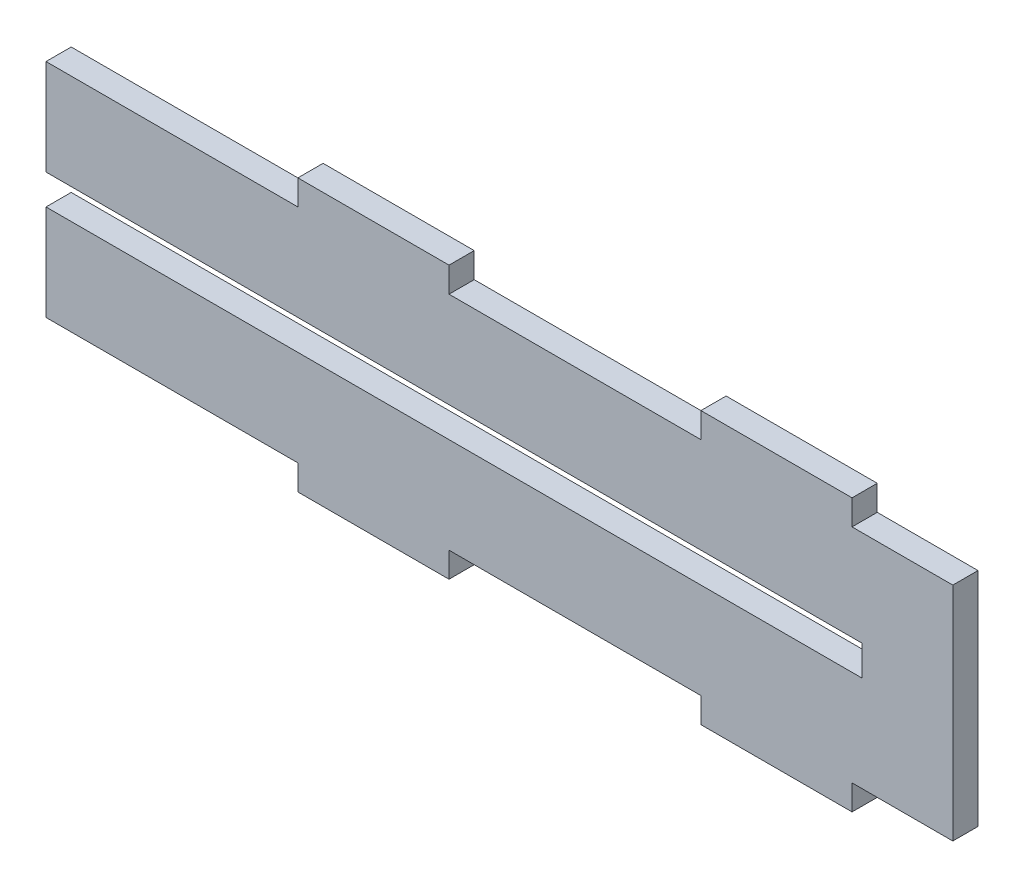
ISO-10303-21;
HEADER;
FILE_DESCRIPTION(('STEP AP214'),'2;1');
FILE_NAME('part.step','',(''),(''),'','','');
FILE_SCHEMA(('AUTOMOTIVE_DESIGN { 1 0 10303 214 1 1 1 1 }'));
ENDSEC;
DATA;
#1=APPLICATION_CONTEXT('core data for automotive mechanical design processes');
#2=APPLICATION_PROTOCOL_DEFINITION('international standard','automotive_design',2000,#1);
#3=PRODUCT_CONTEXT('',#1,'mechanical');
#4=PRODUCT('Part','Part','',(#3));
#5=PRODUCT_RELATED_PRODUCT_CATEGORY('part','',(#4));
#6=PRODUCT_DEFINITION_FORMATION('','',#4);
#7=PRODUCT_DEFINITION_CONTEXT('part definition',#1,'design');
#8=PRODUCT_DEFINITION('design','',#6,#7);
#9=PRODUCT_DEFINITION_SHAPE('','',#8);
#10=(LENGTH_UNIT() NAMED_UNIT(*) SI_UNIT(.MILLI.,.METRE.));
#11=(NAMED_UNIT(*) PLANE_ANGLE_UNIT() SI_UNIT($,.RADIAN.));
#12=(NAMED_UNIT(*) SI_UNIT($,.STERADIAN.) SOLID_ANGLE_UNIT());
#13=UNCERTAINTY_MEASURE_WITH_UNIT(LENGTH_MEASURE(1.E-05),#10,'distance_accuracy_value','');
#14=(GEOMETRIC_REPRESENTATION_CONTEXT(3) GLOBAL_UNCERTAINTY_ASSIGNED_CONTEXT((#13)) GLOBAL_UNIT_ASSIGNED_CONTEXT((#10,
#11,#12)) REPRESENTATION_CONTEXT('',''));
#15=CARTESIAN_POINT('',(0.,0.,0.));
#16=DIRECTION('',(0.,0.,1.));
#17=DIRECTION('',(1.,0.,0.));
#18=AXIS2_PLACEMENT_3D('',#15,#16,#17);
#19=CARTESIAN_POINT('',(180.,0.,5.));
#20=DIRECTION('',(1.,0.,0.));
#21=DIRECTION('',(0.,0.,-1.));
#22=AXIS2_PLACEMENT_3D('',#19,#20,#21);
#23=PLANE('',#22);
#24=DIRECTION('',(0.,-1.,0.));
#25=VECTOR('',#24,1.);
#26=CARTESIAN_POINT('',(180.,0.,0.));
#27=LINE('',#26,#25);
#28=CARTESIAN_POINT('',(180.,0.,0.));
#29=VERTEX_POINT('',#28);
#30=CARTESIAN_POINT('',(180.,-44.,0.));
#31=VERTEX_POINT('',#30);
#32=EDGE_CURVE('E225',#29,#31,#27,.T.);
#33=ORIENTED_EDGE('',*,*,#32,.F.);
#34=DIRECTION('',(0.,0.,-1.));
#35=VECTOR('',#34,1.);
#36=CARTESIAN_POINT('',(180.,0.,5.));
#37=LINE('',#36,#35);
#38=CARTESIAN_POINT('',(180.,0.,5.));
#39=VERTEX_POINT('',#38);
#40=EDGE_CURVE('E11',#39,#29,#37,.T.);
#41=ORIENTED_EDGE('',*,*,#40,.F.);
#42=DIRECTION('',(0.,-1.,0.));
#43=VECTOR('',#42,1.);
#44=CARTESIAN_POINT('',(180.,0.,5.));
#45=LINE('',#44,#43);
#46=CARTESIAN_POINT('',(180.,-44.,5.));
#47=VERTEX_POINT('',#46);
#48=EDGE_CURVE('E283',#39,#47,#45,.T.);
#49=ORIENTED_EDGE('',*,*,#48,.T.);
#50=DIRECTION('',(0.,0.,-1.));
#51=VECTOR('',#50,1.);
#52=CARTESIAN_POINT('',(180.,-44.,5.));
#53=LINE('',#52,#51);
#54=EDGE_CURVE('E136',#47,#31,#53,.T.);
#55=ORIENTED_EDGE('',*,*,#54,.T.);
#56=EDGE_LOOP('',(#33,#41,#49,#55));
#57=FACE_BOUND('',#56,.T.);
#58=ADVANCED_FACE('F37',(#57),#23,.T.);
#59=CARTESIAN_POINT('',(0.,0.,5.));
#60=DIRECTION('',(0.,1.,0.));
#61=DIRECTION('',(0.,0.,1.));
#62=AXIS2_PLACEMENT_3D('',#59,#60,#61);
#63=PLANE('',#62);
#64=DIRECTION('',(1.,0.,0.));
#65=VECTOR('',#64,1.);
#66=CARTESIAN_POINT('',(0.,0.,0.));
#67=LINE('',#66,#65);
#68=CARTESIAN_POINT('',(160.,0.,0.));
#69=VERTEX_POINT('',#68);
#70=EDGE_CURVE('E228',#69,#29,#67,.T.);
#71=ORIENTED_EDGE('',*,*,#70,.F.);
#72=DIRECTION('',(0.,0.,-1.));
#73=VECTOR('',#72,1.);
#74=CARTESIAN_POINT('',(160.,0.,5.));
#75=LINE('',#74,#73);
#76=CARTESIAN_POINT('',(160.,0.,5.));
#77=VERTEX_POINT('',#76);
#78=EDGE_CURVE('E45',#77,#69,#75,.T.);
#79=ORIENTED_EDGE('',*,*,#78,.F.);
#80=DIRECTION('',(1.,0.,0.));
#81=VECTOR('',#80,1.);
#82=CARTESIAN_POINT('',(0.,0.,5.));
#83=LINE('',#82,#81);
#84=EDGE_CURVE('E352',#77,#39,#83,.T.);
#85=ORIENTED_EDGE('',*,*,#84,.T.);
#86=ORIENTED_EDGE('',*,*,#40,.T.);
#87=EDGE_LOOP('',(#71,#79,#85,#86));
#88=FACE_BOUND('',#87,.T.);
#89=ADVANCED_FACE('F340',(#88),#63,.T.);
#90=CARTESIAN_POINT('',(160.,0.,5.));
#91=DIRECTION('',(1.,0.,0.));
#92=DIRECTION('',(0.,0.,-1.));
#93=AXIS2_PLACEMENT_3D('',#90,#91,#92);
#94=PLANE('',#93);
#95=DIRECTION('',(0.,-1.,0.));
#96=VECTOR('',#95,1.);
#97=CARTESIAN_POINT('',(160.,0.,0.));
#98=LINE('',#97,#96);
#99=CARTESIAN_POINT('',(160.,5.,0.));
#100=VERTEX_POINT('',#99);
#101=EDGE_CURVE('E231',#100,#69,#98,.T.);
#102=ORIENTED_EDGE('',*,*,#101,.F.);
#103=DIRECTION('',(0.,0.,-1.));
#104=VECTOR('',#103,1.);
#105=CARTESIAN_POINT('',(160.,5.,5.));
#106=LINE('',#105,#104);
#107=CARTESIAN_POINT('',(160.,5.,5.));
#108=VERTEX_POINT('',#107);
#109=EDGE_CURVE('E329',#108,#100,#106,.T.);
#110=ORIENTED_EDGE('',*,*,#109,.F.);
#111=DIRECTION('',(0.,-1.,0.));
#112=VECTOR('',#111,1.);
#113=CARTESIAN_POINT('',(160.,0.,5.));
#114=LINE('',#113,#112);
#115=EDGE_CURVE('E336',#108,#77,#114,.T.);
#116=ORIENTED_EDGE('',*,*,#115,.T.);
#117=ORIENTED_EDGE('',*,*,#78,.T.);
#118=EDGE_LOOP('',(#102,#110,#116,#117));
#119=FACE_BOUND('',#118,.T.);
#120=ADVANCED_FACE('F334',(#119),#94,.T.);
#121=CARTESIAN_POINT('',(0.,5.,5.));
#122=DIRECTION('',(0.,1.,0.));
#123=DIRECTION('',(0.,0.,1.));
#124=AXIS2_PLACEMENT_3D('',#121,#122,#123);
#125=PLANE('',#124);
#126=DIRECTION('',(1.,0.,0.));
#127=VECTOR('',#126,1.);
#128=CARTESIAN_POINT('',(0.,5.,0.));
#129=LINE('',#128,#127);
#130=CARTESIAN_POINT('',(130.,5.,0.));
#131=VERTEX_POINT('',#130);
#132=EDGE_CURVE('E234',#131,#100,#129,.T.);
#133=ORIENTED_EDGE('',*,*,#132,.F.);
#134=DIRECTION('',(0.,0.,-1.));
#135=VECTOR('',#134,1.);
#136=CARTESIAN_POINT('',(130.,5.,5.));
#137=LINE('',#136,#135);
#138=CARTESIAN_POINT('',(130.,5.,5.));
#139=VERTEX_POINT('',#138);
#140=EDGE_CURVE('E327',#139,#131,#137,.T.);
#141=ORIENTED_EDGE('',*,*,#140,.F.);
#142=DIRECTION('',(1.,0.,0.));
#143=VECTOR('',#142,1.);
#144=CARTESIAN_POINT('',(0.,5.,5.));
#145=LINE('',#144,#143);
#146=EDGE_CURVE('E349',#139,#108,#145,.T.);
#147=ORIENTED_EDGE('',*,*,#146,.T.);
#148=ORIENTED_EDGE('',*,*,#109,.T.);
#149=EDGE_LOOP('',(#133,#141,#147,#148));
#150=FACE_BOUND('',#149,.T.);
#151=ADVANCED_FACE('F346',(#150),#125,.T.);
#152=CARTESIAN_POINT('',(130.,0.,5.));
#153=DIRECTION('',(-1.,0.,0.));
#154=DIRECTION('',(0.,0.,1.));
#155=AXIS2_PLACEMENT_3D('',#152,#153,#154);
#156=PLANE('',#155);
#157=DIRECTION('',(0.,1.,0.));
#158=VECTOR('',#157,1.);
#159=CARTESIAN_POINT('',(130.,0.,0.));
#160=LINE('',#159,#158);
#161=CARTESIAN_POINT('',(130.,0.,0.));
#162=VERTEX_POINT('',#161);
#163=EDGE_CURVE('E237',#162,#131,#160,.T.);
#164=ORIENTED_EDGE('',*,*,#163,.F.);
#165=DIRECTION('',(0.,0.,-1.));
#166=VECTOR('',#165,1.);
#167=CARTESIAN_POINT('',(130.,0.,5.));
#168=LINE('',#167,#166);
#169=CARTESIAN_POINT('',(130.,0.,5.));
#170=VERTEX_POINT('',#169);
#171=EDGE_CURVE('E325',#170,#162,#168,.T.);
#172=ORIENTED_EDGE('',*,*,#171,.F.);
#173=DIRECTION('',(0.,1.,0.));
#174=VECTOR('',#173,1.);
#175=CARTESIAN_POINT('',(130.,0.,5.));
#176=LINE('',#175,#174);
#177=EDGE_CURVE('E354',#170,#139,#176,.T.);
#178=ORIENTED_EDGE('',*,*,#177,.T.);
#179=ORIENTED_EDGE('',*,*,#140,.T.);
#180=EDGE_LOOP('',(#164,#172,#178,#179));
#181=FACE_BOUND('',#180,.T.);
#182=ADVANCED_FACE('F419',(#181),#156,.T.);
#183=CARTESIAN_POINT('',(0.,0.,5.));
#184=DIRECTION('',(0.,1.,0.));
#185=DIRECTION('',(0.,0.,1.));
#186=AXIS2_PLACEMENT_3D('',#183,#184,#185);
#187=PLANE('',#186);
#188=DIRECTION('',(1.,0.,0.));
#189=VECTOR('',#188,1.);
#190=CARTESIAN_POINT('',(0.,0.,0.));
#191=LINE('',#190,#189);
#192=CARTESIAN_POINT('',(80.,0.,0.));
#193=VERTEX_POINT('',#192);
#194=EDGE_CURVE('E240',#193,#162,#191,.T.);
#195=ORIENTED_EDGE('',*,*,#194,.F.);
#196=DIRECTION('',(0.,0.,-1.));
#197=VECTOR('',#196,1.);
#198=CARTESIAN_POINT('',(80.,0.,5.));
#199=LINE('',#198,#197);
#200=CARTESIAN_POINT('',(80.,0.,5.));
#201=VERTEX_POINT('',#200);
#202=EDGE_CURVE('E323',#201,#193,#199,.T.);
#203=ORIENTED_EDGE('',*,*,#202,.F.);
#204=DIRECTION('',(1.,0.,0.));
#205=VECTOR('',#204,1.);
#206=CARTESIAN_POINT('',(0.,0.,5.));
#207=LINE('',#206,#205);
#208=EDGE_CURVE('E360',#201,#170,#207,.T.);
#209=ORIENTED_EDGE('',*,*,#208,.T.);
#210=ORIENTED_EDGE('',*,*,#171,.T.);
#211=EDGE_LOOP('',(#195,#203,#209,#210));
#212=FACE_BOUND('',#211,.T.);
#213=ADVANCED_FACE('F422',(#212),#187,.T.);
#214=CARTESIAN_POINT('',(80.,0.,5.));
#215=DIRECTION('',(1.,0.,0.));
#216=DIRECTION('',(0.,0.,-1.));
#217=AXIS2_PLACEMENT_3D('',#214,#215,#216);
#218=PLANE('',#217);
#219=DIRECTION('',(0.,-1.,0.));
#220=VECTOR('',#219,1.);
#221=CARTESIAN_POINT('',(80.,0.,0.));
#222=LINE('',#221,#220);
#223=CARTESIAN_POINT('',(80.,5.,0.));
#224=VERTEX_POINT('',#223);
#225=EDGE_CURVE('E243',#224,#193,#222,.T.);
#226=ORIENTED_EDGE('',*,*,#225,.F.);
#227=DIRECTION('',(0.,0.,-1.));
#228=VECTOR('',#227,1.);
#229=CARTESIAN_POINT('',(80.,5.,5.));
#230=LINE('',#229,#228);
#231=CARTESIAN_POINT('',(80.,5.,5.));
#232=VERTEX_POINT('',#231);
#233=EDGE_CURVE('E321',#232,#224,#230,.T.);
#234=ORIENTED_EDGE('',*,*,#233,.F.);
#235=DIRECTION('',(0.,-1.,0.));
#236=VECTOR('',#235,1.);
#237=CARTESIAN_POINT('',(80.,0.,5.));
#238=LINE('',#237,#236);
#239=EDGE_CURVE('E363',#232,#201,#238,.T.);
#240=ORIENTED_EDGE('',*,*,#239,.T.);
#241=ORIENTED_EDGE('',*,*,#202,.T.);
#242=EDGE_LOOP('',(#226,#234,#240,#241));
#243=FACE_BOUND('',#242,.T.);
#244=ADVANCED_FACE('F426',(#243),#218,.T.);
#245=CARTESIAN_POINT('',(0.,4.99999999999996,5.));
#246=DIRECTION('',(0.,1.,0.));
#247=DIRECTION('',(-1.,0.,0.));
#248=AXIS2_PLACEMENT_3D('',#245,#246,#247);
#249=PLANE('',#248);
#250=DIRECTION('',(1.,0.,0.));
#251=VECTOR('',#250,1.);
#252=CARTESIAN_POINT('',(0.,4.99999999999996,0.));
#253=LINE('',#252,#251);
#254=CARTESIAN_POINT('',(50.,4.99999999999998,0.));
#255=VERTEX_POINT('',#254);
#256=EDGE_CURVE('E246',#255,#224,#253,.T.);
#257=ORIENTED_EDGE('',*,*,#256,.F.);
#258=DIRECTION('',(0.,0.,-1.));
#259=VECTOR('',#258,1.);
#260=CARTESIAN_POINT('',(50.,4.99999999999998,5.));
#261=LINE('',#260,#259);
#262=CARTESIAN_POINT('',(50.,4.99999999999998,5.));
#263=VERTEX_POINT('',#262);
#264=EDGE_CURVE('E319',#263,#255,#261,.T.);
#265=ORIENTED_EDGE('',*,*,#264,.F.);
#266=DIRECTION('',(1.,0.,0.));
#267=VECTOR('',#266,1.);
#268=CARTESIAN_POINT('',(0.,4.99999999999996,5.));
#269=LINE('',#268,#267);
#270=EDGE_CURVE('E366',#263,#232,#269,.T.);
#271=ORIENTED_EDGE('',*,*,#270,.T.);
#272=ORIENTED_EDGE('',*,*,#233,.T.);
#273=EDGE_LOOP('',(#257,#265,#271,#272));
#274=FACE_BOUND('',#273,.T.);
#275=ADVANCED_FACE('F430',(#274),#249,.T.);
#276=CARTESIAN_POINT('',(50.,0.,5.));
#277=DIRECTION('',(-1.,0.,0.));
#278=DIRECTION('',(0.,-1.,0.));
#279=AXIS2_PLACEMENT_3D('',#276,#277,#278);
#280=PLANE('',#279);
#281=DIRECTION('',(0.,1.,0.));
#282=VECTOR('',#281,1.);
#283=CARTESIAN_POINT('',(50.,0.,0.));
#284=LINE('',#283,#282);
#285=CARTESIAN_POINT('',(50.,0.,0.));
#286=VERTEX_POINT('',#285);
#287=EDGE_CURVE('E249',#286,#255,#284,.T.);
#288=ORIENTED_EDGE('',*,*,#287,.F.);
#289=DIRECTION('',(0.,0.,-1.));
#290=VECTOR('',#289,1.);
#291=CARTESIAN_POINT('',(50.,0.,5.));
#292=LINE('',#291,#290);
#293=CARTESIAN_POINT('',(50.,0.,5.));
#294=VERTEX_POINT('',#293);
#295=EDGE_CURVE('E317',#294,#286,#292,.T.);
#296=ORIENTED_EDGE('',*,*,#295,.F.);
#297=DIRECTION('',(0.,1.,0.));
#298=VECTOR('',#297,1.);
#299=CARTESIAN_POINT('',(50.,0.,5.));
#300=LINE('',#299,#298);
#301=EDGE_CURVE('E369',#294,#263,#300,.T.);
#302=ORIENTED_EDGE('',*,*,#301,.T.);
#303=ORIENTED_EDGE('',*,*,#264,.T.);
#304=EDGE_LOOP('',(#288,#296,#302,#303));
#305=FACE_BOUND('',#304,.T.);
#306=ADVANCED_FACE('F434',(#305),#280,.T.);
#307=CARTESIAN_POINT('',(0.,0.,5.));
#308=DIRECTION('',(0.,1.,0.));
#309=DIRECTION('',(-1.,0.,0.));
#310=AXIS2_PLACEMENT_3D('',#307,#308,#309);
#311=PLANE('',#310);
#312=DIRECTION('',(1.,0.,0.));
#313=VECTOR('',#312,1.);
#314=CARTESIAN_POINT('',(0.,0.,0.));
#315=LINE('',#314,#313);
#316=CARTESIAN_POINT('',(0.,0.,0.));
#317=VERTEX_POINT('',#316);
#318=EDGE_CURVE('E252',#317,#286,#315,.T.);
#319=ORIENTED_EDGE('',*,*,#318,.F.);
#320=DIRECTION('',(0.,0.,-1.));
#321=VECTOR('',#320,1.);
#322=CARTESIAN_POINT('',(0.,0.,5.));
#323=LINE('',#322,#321);
#324=CARTESIAN_POINT('',(0.,0.,5.));
#325=VERTEX_POINT('',#324);
#326=EDGE_CURVE('E315',#325,#317,#323,.T.);
#327=ORIENTED_EDGE('',*,*,#326,.F.);
#328=DIRECTION('',(1.,0.,0.));
#329=VECTOR('',#328,1.);
#330=CARTESIAN_POINT('',(0.,0.,5.));
#331=LINE('',#330,#329);
#332=EDGE_CURVE('E372',#325,#294,#331,.T.);
#333=ORIENTED_EDGE('',*,*,#332,.T.);
#334=ORIENTED_EDGE('',*,*,#295,.T.);
#335=EDGE_LOOP('',(#319,#327,#333,#334));
#336=FACE_BOUND('',#335,.T.);
#337=ADVANCED_FACE('F438',(#336),#311,.T.);
#338=CARTESIAN_POINT('',(0.,0.,5.));
#339=DIRECTION('',(1.,0.,0.));
#340=DIRECTION('',(0.,1.,0.));
#341=AXIS2_PLACEMENT_3D('',#338,#339,#340);
#342=PLANE('',#341);
#343=DIRECTION('',(0.,-1.,0.));
#344=VECTOR('',#343,1.);
#345=CARTESIAN_POINT('',(0.,0.,0.));
#346=LINE('',#345,#344);
#347=CARTESIAN_POINT('',(0.,-19.,0.));
#348=VERTEX_POINT('',#347);
#349=EDGE_CURVE('E255',#317,#348,#346,.T.);
#350=ORIENTED_EDGE('',*,*,#349,.T.);
#351=DIRECTION('',(0.,0.,-1.));
#352=VECTOR('',#351,1.);
#353=CARTESIAN_POINT('',(0.,-19.,5.));
#354=LINE('',#353,#352);
#355=CARTESIAN_POINT('',(0.,-19.,5.));
#356=VERTEX_POINT('',#355);
#357=EDGE_CURVE('E312',#356,#348,#354,.T.);
#358=ORIENTED_EDGE('',*,*,#357,.F.);
#359=DIRECTION('',(0.,-1.,0.));
#360=VECTOR('',#359,1.);
#361=CARTESIAN_POINT('',(0.,0.,5.));
#362=LINE('',#361,#360);
#363=EDGE_CURVE('E375',#325,#356,#362,.T.);
#364=ORIENTED_EDGE('',*,*,#363,.F.);
#365=ORIENTED_EDGE('',*,*,#326,.T.);
#366=EDGE_LOOP('',(#350,#358,#364,#365));
#367=FACE_BOUND('',#366,.T.);
#368=ADVANCED_FACE('F442',(#367),#342,.F.);
#369=CARTESIAN_POINT('',(0.,-19.,5.));
#370=DIRECTION('',(0.,1.,0.));
#371=DIRECTION('',(-1.,0.,0.));
#372=AXIS2_PLACEMENT_3D('',#369,#370,#371);
#373=PLANE('',#372);
#374=DIRECTION('',(1.,0.,0.));
#375=VECTOR('',#374,1.);
#376=CARTESIAN_POINT('',(0.,-19.,0.));
#377=LINE('',#376,#375);
#378=CARTESIAN_POINT('',(162.,-19.,0.));
#379=VERTEX_POINT('',#378);
#380=EDGE_CURVE('E257',#348,#379,#377,.T.);
#381=ORIENTED_EDGE('',*,*,#380,.T.);
#382=DIRECTION('',(0.,0.,-1.));
#383=VECTOR('',#382,1.);
#384=CARTESIAN_POINT('',(162.,-19.,5.));
#385=LINE('',#384,#383);
#386=CARTESIAN_POINT('',(162.,-19.,5.));
#387=VERTEX_POINT('',#386);
#388=EDGE_CURVE('E309',#387,#379,#385,.T.);
#389=ORIENTED_EDGE('',*,*,#388,.F.);
#390=DIRECTION('',(1.,0.,0.));
#391=VECTOR('',#390,1.);
#392=CARTESIAN_POINT('',(0.,-19.,5.));
#393=LINE('',#392,#391);
#394=EDGE_CURVE('E377',#356,#387,#393,.T.);
#395=ORIENTED_EDGE('',*,*,#394,.F.);
#396=ORIENTED_EDGE('',*,*,#357,.T.);
#397=EDGE_LOOP('',(#381,#389,#395,#396));
#398=FACE_BOUND('',#397,.T.);
#399=ADVANCED_FACE('F446',(#398),#373,.F.);
#400=CARTESIAN_POINT('',(162.,0.,5.));
#401=DIRECTION('',(1.,0.,0.));
#402=DIRECTION('',(0.,0.,-1.));
#403=AXIS2_PLACEMENT_3D('',#400,#401,#402);
#404=PLANE('',#403);
#405=DIRECTION('',(0.,-1.,0.));
#406=VECTOR('',#405,1.);
#407=CARTESIAN_POINT('',(162.,0.,0.));
#408=LINE('',#407,#406);
#409=CARTESIAN_POINT('',(162.,-25.,0.));
#410=VERTEX_POINT('',#409);
#411=EDGE_CURVE('E259',#379,#410,#408,.T.);
#412=ORIENTED_EDGE('',*,*,#411,.T.);
#413=DIRECTION('',(0.,0.,-1.));
#414=VECTOR('',#413,1.);
#415=CARTESIAN_POINT('',(162.,-25.,5.));
#416=LINE('',#415,#414);
#417=CARTESIAN_POINT('',(162.,-25.,5.));
#418=VERTEX_POINT('',#417);
#419=EDGE_CURVE('E307',#418,#410,#416,.T.);
#420=ORIENTED_EDGE('',*,*,#419,.F.);
#421=DIRECTION('',(0.,-1.,0.));
#422=VECTOR('',#421,1.);
#423=CARTESIAN_POINT('',(162.,0.,5.));
#424=LINE('',#423,#422);
#425=EDGE_CURVE('E379',#387,#418,#424,.T.);
#426=ORIENTED_EDGE('',*,*,#425,.F.);
#427=ORIENTED_EDGE('',*,*,#388,.T.);
#428=EDGE_LOOP('',(#412,#420,#426,#427));
#429=FACE_BOUND('',#428,.T.);
#430=ADVANCED_FACE('F450',(#429),#404,.F.);
#431=CARTESIAN_POINT('',(0.,-25.,5.));
#432=DIRECTION('',(0.,1.,0.));
#433=DIRECTION('',(0.,0.,1.));
#434=AXIS2_PLACEMENT_3D('',#431,#432,#433);
#435=PLANE('',#434);
#436=DIRECTION('',(1.,0.,0.));
#437=VECTOR('',#436,1.);
#438=CARTESIAN_POINT('',(0.,-25.,0.));
#439=LINE('',#438,#437);
#440=CARTESIAN_POINT('',(0.,-25.,0.));
#441=VERTEX_POINT('',#440);
#442=EDGE_CURVE('E262',#441,#410,#439,.T.);
#443=ORIENTED_EDGE('',*,*,#442,.F.);
#444=DIRECTION('',(0.,0.,-1.));
#445=VECTOR('',#444,1.);
#446=CARTESIAN_POINT('',(0.,-25.,5.));
#447=LINE('',#446,#445);
#448=CARTESIAN_POINT('',(0.,-25.,5.));
#449=VERTEX_POINT('',#448);
#450=EDGE_CURVE('E305',#449,#441,#447,.T.);
#451=ORIENTED_EDGE('',*,*,#450,.F.);
#452=DIRECTION('',(1.,0.,0.));
#453=VECTOR('',#452,1.);
#454=CARTESIAN_POINT('',(0.,-25.,5.));
#455=LINE('',#454,#453);
#456=EDGE_CURVE('E381',#449,#418,#455,.T.);
#457=ORIENTED_EDGE('',*,*,#456,.T.);
#458=ORIENTED_EDGE('',*,*,#419,.T.);
#459=EDGE_LOOP('',(#443,#451,#457,#458));
#460=FACE_BOUND('',#459,.T.);
#461=ADVANCED_FACE('F454',(#460),#435,.T.);
#462=CARTESIAN_POINT('',(0.,0.,5.));
#463=DIRECTION('',(1.,0.,0.));
#464=DIRECTION('',(0.,1.,0.));
#465=AXIS2_PLACEMENT_3D('',#462,#463,#464);
#466=PLANE('',#465);
#467=DIRECTION('',(0.,-1.,0.));
#468=VECTOR('',#467,1.);
#469=CARTESIAN_POINT('',(0.,0.,0.));
#470=LINE('',#469,#468);
#471=CARTESIAN_POINT('',(0.,-44.,0.));
#472=VERTEX_POINT('',#471);
#473=EDGE_CURVE('E265',#441,#472,#470,.T.);
#474=ORIENTED_EDGE('',*,*,#473,.T.);
#475=DIRECTION('',(0.,0.,-1.));
#476=VECTOR('',#475,1.);
#477=CARTESIAN_POINT('',(0.,-44.,5.));
#478=LINE('',#477,#476);
#479=CARTESIAN_POINT('',(0.,-44.,5.));
#480=VERTEX_POINT('',#479);
#481=EDGE_CURVE('E302',#480,#472,#478,.T.);
#482=ORIENTED_EDGE('',*,*,#481,.F.);
#483=DIRECTION('',(0.,-1.,0.));
#484=VECTOR('',#483,1.);
#485=CARTESIAN_POINT('',(0.,0.,5.));
#486=LINE('',#485,#484);
#487=EDGE_CURVE('E384',#449,#480,#486,.T.);
#488=ORIENTED_EDGE('',*,*,#487,.F.);
#489=ORIENTED_EDGE('',*,*,#450,.T.);
#490=EDGE_LOOP('',(#474,#482,#488,#489));
#491=FACE_BOUND('',#490,.T.);
#492=ADVANCED_FACE('F458',(#491),#466,.F.);
#493=CARTESIAN_POINT('',(0.,-44.,5.));
#494=DIRECTION('',(0.,1.,0.));
#495=DIRECTION('',(-1.,0.,0.));
#496=AXIS2_PLACEMENT_3D('',#493,#494,#495);
#497=PLANE('',#496);
#498=DIRECTION('',(1.,0.,0.));
#499=VECTOR('',#498,1.);
#500=CARTESIAN_POINT('',(0.,-44.,0.));
#501=LINE('',#500,#499);
#502=CARTESIAN_POINT('',(50.,-44.,0.));
#503=VERTEX_POINT('',#502);
#504=EDGE_CURVE('E267',#472,#503,#501,.T.);
#505=ORIENTED_EDGE('',*,*,#504,.T.);
#506=DIRECTION('',(0.,0.,-1.));
#507=VECTOR('',#506,1.);
#508=CARTESIAN_POINT('',(50.,-44.,5.));
#509=LINE('',#508,#507);
#510=CARTESIAN_POINT('',(50.,-44.,5.));
#511=VERTEX_POINT('',#510);
#512=EDGE_CURVE('E299',#511,#503,#509,.T.);
#513=ORIENTED_EDGE('',*,*,#512,.F.);
#514=DIRECTION('',(1.,0.,0.));
#515=VECTOR('',#514,1.);
#516=CARTESIAN_POINT('',(0.,-44.,5.));
#517=LINE('',#516,#515);
#518=EDGE_CURVE('E386',#480,#511,#517,.T.);
#519=ORIENTED_EDGE('',*,*,#518,.F.);
#520=ORIENTED_EDGE('',*,*,#481,.T.);
#521=EDGE_LOOP('',(#505,#513,#519,#520));
#522=FACE_BOUND('',#521,.T.);
#523=ADVANCED_FACE('F462',(#522),#497,.F.);
#524=CARTESIAN_POINT('',(50.,0.,5.));
#525=DIRECTION('',(1.,0.,0.));
#526=DIRECTION('',(0.,0.,-1.));
#527=AXIS2_PLACEMENT_3D('',#524,#525,#526);
#528=PLANE('',#527);
#529=DIRECTION('',(0.,-1.,0.));
#530=VECTOR('',#529,1.);
#531=CARTESIAN_POINT('',(50.,0.,0.));
#532=LINE('',#531,#530);
#533=CARTESIAN_POINT('',(50.,-49.,0.));
#534=VERTEX_POINT('',#533);
#535=EDGE_CURVE('E269',#503,#534,#532,.T.);
#536=ORIENTED_EDGE('',*,*,#535,.T.);
#537=DIRECTION('',(0.,0.,-1.));
#538=VECTOR('',#537,1.);
#539=CARTESIAN_POINT('',(50.,-49.,5.));
#540=LINE('',#539,#538);
#541=CARTESIAN_POINT('',(50.,-49.,5.));
#542=VERTEX_POINT('',#541);
#543=EDGE_CURVE('E296',#542,#534,#540,.T.);
#544=ORIENTED_EDGE('',*,*,#543,.F.);
#545=DIRECTION('',(0.,-1.,0.));
#546=VECTOR('',#545,1.);
#547=CARTESIAN_POINT('',(50.,0.,5.));
#548=LINE('',#547,#546);
#549=EDGE_CURVE('E388',#511,#542,#548,.T.);
#550=ORIENTED_EDGE('',*,*,#549,.F.);
#551=ORIENTED_EDGE('',*,*,#512,.T.);
#552=EDGE_LOOP('',(#536,#544,#550,#551));
#553=FACE_BOUND('',#552,.T.);
#554=ADVANCED_FACE('F466',(#553),#528,.F.);
#555=CARTESIAN_POINT('',(0.,-49.,5.));
#556=DIRECTION('',(0.,1.,0.));
#557=DIRECTION('',(0.,0.,1.));
#558=AXIS2_PLACEMENT_3D('',#555,#556,#557);
#559=PLANE('',#558);
#560=DIRECTION('',(1.,0.,0.));
#561=VECTOR('',#560,1.);
#562=CARTESIAN_POINT('',(0.,-49.,0.));
#563=LINE('',#562,#561);
#564=CARTESIAN_POINT('',(80.,-49.,0.));
#565=VERTEX_POINT('',#564);
#566=EDGE_CURVE('E271',#534,#565,#563,.T.);
#567=ORIENTED_EDGE('',*,*,#566,.T.);
#568=DIRECTION('',(0.,0.,-1.));
#569=VECTOR('',#568,1.);
#570=CARTESIAN_POINT('',(80.,-49.,5.));
#571=LINE('',#570,#569);
#572=CARTESIAN_POINT('',(80.,-49.,5.));
#573=VERTEX_POINT('',#572);
#574=EDGE_CURVE('E293',#573,#565,#571,.T.);
#575=ORIENTED_EDGE('',*,*,#574,.F.);
#576=DIRECTION('',(1.,0.,0.));
#577=VECTOR('',#576,1.);
#578=CARTESIAN_POINT('',(0.,-49.,5.));
#579=LINE('',#578,#577);
#580=EDGE_CURVE('E390',#542,#573,#579,.T.);
#581=ORIENTED_EDGE('',*,*,#580,.F.);
#582=ORIENTED_EDGE('',*,*,#543,.T.);
#583=EDGE_LOOP('',(#567,#575,#581,#582));
#584=FACE_BOUND('',#583,.T.);
#585=ADVANCED_FACE('F470',(#584),#559,.F.);
#586=CARTESIAN_POINT('',(80.,0.,5.));
#587=DIRECTION('',(-1.,0.,0.));
#588=DIRECTION('',(0.,0.,1.));
#589=AXIS2_PLACEMENT_3D('',#586,#587,#588);
#590=PLANE('',#589);
#591=DIRECTION('',(0.,1.,0.));
#592=VECTOR('',#591,1.);
#593=CARTESIAN_POINT('',(80.,0.,0.));
#594=LINE('',#593,#592);
#595=CARTESIAN_POINT('',(80.,-44.,0.));
#596=VERTEX_POINT('',#595);
#597=EDGE_CURVE('E273',#565,#596,#594,.T.);
#598=ORIENTED_EDGE('',*,*,#597,.T.);
#599=DIRECTION('',(0.,0.,-1.));
#600=VECTOR('',#599,1.);
#601=CARTESIAN_POINT('',(80.,-44.,5.));
#602=LINE('',#601,#600);
#603=CARTESIAN_POINT('',(80.,-44.,5.));
#604=VERTEX_POINT('',#603);
#605=EDGE_CURVE('E290',#604,#596,#602,.T.);
#606=ORIENTED_EDGE('',*,*,#605,.F.);
#607=DIRECTION('',(0.,1.,0.));
#608=VECTOR('',#607,1.);
#609=CARTESIAN_POINT('',(80.,0.,5.));
#610=LINE('',#609,#608);
#611=EDGE_CURVE('E392',#573,#604,#610,.T.);
#612=ORIENTED_EDGE('',*,*,#611,.F.);
#613=ORIENTED_EDGE('',*,*,#574,.T.);
#614=EDGE_LOOP('',(#598,#606,#612,#613));
#615=FACE_BOUND('',#614,.T.);
#616=ADVANCED_FACE('F474',(#615),#590,.F.);
#617=CARTESIAN_POINT('',(0.,-44.,5.));
#618=DIRECTION('',(0.,1.,0.));
#619=DIRECTION('',(0.,0.,1.));
#620=AXIS2_PLACEMENT_3D('',#617,#618,#619);
#621=PLANE('',#620);
#622=DIRECTION('',(1.,0.,0.));
#623=VECTOR('',#622,1.);
#624=CARTESIAN_POINT('',(0.,-44.,0.));
#625=LINE('',#624,#623);
#626=CARTESIAN_POINT('',(130.,-44.,0.));
#627=VERTEX_POINT('',#626);
#628=EDGE_CURVE('E275',#596,#627,#625,.T.);
#629=ORIENTED_EDGE('',*,*,#628,.T.);
#630=DIRECTION('',(0.,0.,-1.));
#631=VECTOR('',#630,1.);
#632=CARTESIAN_POINT('',(130.,-44.,5.));
#633=LINE('',#632,#631);
#634=CARTESIAN_POINT('',(130.,-44.,5.));
#635=VERTEX_POINT('',#634);
#636=EDGE_CURVE('E287',#635,#627,#633,.T.);
#637=ORIENTED_EDGE('',*,*,#636,.F.);
#638=DIRECTION('',(1.,0.,0.));
#639=VECTOR('',#638,1.);
#640=CARTESIAN_POINT('',(0.,-44.,5.));
#641=LINE('',#640,#639);
#642=EDGE_CURVE('E394',#604,#635,#641,.T.);
#643=ORIENTED_EDGE('',*,*,#642,.F.);
#644=ORIENTED_EDGE('',*,*,#605,.T.);
#645=EDGE_LOOP('',(#629,#637,#643,#644));
#646=FACE_BOUND('',#645,.T.);
#647=ADVANCED_FACE('F400',(#646),#621,.F.);
#648=CARTESIAN_POINT('',(130.,0.,5.));
#649=DIRECTION('',(1.,0.,0.));
#650=DIRECTION('',(0.,0.,-1.));
#651=AXIS2_PLACEMENT_3D('',#648,#649,#650);
#652=PLANE('',#651);
#653=DIRECTION('',(0.,-1.,0.));
#654=VECTOR('',#653,1.);
#655=CARTESIAN_POINT('',(130.,0.,0.));
#656=LINE('',#655,#654);
#657=CARTESIAN_POINT('',(130.,-49.,0.));
#658=VERTEX_POINT('',#657);
#659=EDGE_CURVE('E277',#627,#658,#656,.T.);
#660=ORIENTED_EDGE('',*,*,#659,.T.);
#661=DIRECTION('',(0.,0.,-1.));
#662=VECTOR('',#661,1.);
#663=CARTESIAN_POINT('',(130.,-49.,5.));
#664=LINE('',#663,#662);
#665=CARTESIAN_POINT('',(130.,-49.,5.));
#666=VERTEX_POINT('',#665);
#667=EDGE_CURVE('E217',#666,#658,#664,.T.);
#668=ORIENTED_EDGE('',*,*,#667,.F.);
#669=DIRECTION('',(0.,-1.,0.));
#670=VECTOR('',#669,1.);
#671=CARTESIAN_POINT('',(130.,0.,5.));
#672=LINE('',#671,#670);
#673=EDGE_CURVE('E208',#635,#666,#672,.T.);
#674=ORIENTED_EDGE('',*,*,#673,.F.);
#675=ORIENTED_EDGE('',*,*,#636,.T.);
#676=EDGE_LOOP('',(#660,#668,#674,#675));
#677=FACE_BOUND('',#676,.T.);
#678=ADVANCED_FACE('F404',(#677),#652,.F.);
#679=CARTESIAN_POINT('',(0.,-49.,5.));
#680=DIRECTION('',(0.,1.,0.));
#681=DIRECTION('',(0.,0.,1.));
#682=AXIS2_PLACEMENT_3D('',#679,#680,#681);
#683=PLANE('',#682);
#684=DIRECTION('',(1.,0.,0.));
#685=VECTOR('',#684,1.);
#686=CARTESIAN_POINT('',(0.,-49.,0.));
#687=LINE('',#686,#685);
#688=CARTESIAN_POINT('',(160.,-49.,0.));
#689=VERTEX_POINT('',#688);
#690=EDGE_CURVE('E216',#658,#689,#687,.T.);
#691=ORIENTED_EDGE('',*,*,#690,.T.);
#692=DIRECTION('',(0.,0.,-1.));
#693=VECTOR('',#692,1.);
#694=CARTESIAN_POINT('',(160.,-49.,5.));
#695=LINE('',#694,#693);
#696=CARTESIAN_POINT('',(160.,-49.,5.));
#697=VERTEX_POINT('',#696);
#698=EDGE_CURVE('E213',#697,#689,#695,.T.);
#699=ORIENTED_EDGE('',*,*,#698,.F.);
#700=DIRECTION('',(1.,0.,0.));
#701=VECTOR('',#700,1.);
#702=CARTESIAN_POINT('',(0.,-49.,5.));
#703=LINE('',#702,#701);
#704=EDGE_CURVE('E202',#666,#697,#703,.T.);
#705=ORIENTED_EDGE('',*,*,#704,.F.);
#706=ORIENTED_EDGE('',*,*,#667,.T.);
#707=EDGE_LOOP('',(#691,#699,#705,#706));
#708=FACE_BOUND('',#707,.T.);
#709=ADVANCED_FACE('F214',(#708),#683,.F.);
#710=CARTESIAN_POINT('',(160.,0.,5.));
#711=DIRECTION('',(-1.,0.,0.));
#712=DIRECTION('',(0.,0.,1.));
#713=AXIS2_PLACEMENT_3D('',#710,#711,#712);
#714=PLANE('',#713);
#715=DIRECTION('',(0.,1.,0.));
#716=VECTOR('',#715,1.);
#717=CARTESIAN_POINT('',(160.,0.,0.));
#718=LINE('',#717,#716);
#719=CARTESIAN_POINT('',(160.,-44.,0.));
#720=VERTEX_POINT('',#719);
#721=EDGE_CURVE('E129',#689,#720,#718,.T.);
#722=ORIENTED_EDGE('',*,*,#721,.T.);
#723=DIRECTION('',(0.,0.,-1.));
#724=VECTOR('',#723,1.);
#725=CARTESIAN_POINT('',(160.,-44.,5.));
#726=LINE('',#725,#724);
#727=CARTESIAN_POINT('',(160.,-44.,5.));
#728=VERTEX_POINT('',#727);
#729=EDGE_CURVE('E218',#728,#720,#726,.T.);
#730=ORIENTED_EDGE('',*,*,#729,.F.);
#731=DIRECTION('',(0.,1.,0.));
#732=VECTOR('',#731,1.);
#733=CARTESIAN_POINT('',(160.,0.,5.));
#734=LINE('',#733,#732);
#735=EDGE_CURVE('E206',#697,#728,#734,.T.);
#736=ORIENTED_EDGE('',*,*,#735,.F.);
#737=ORIENTED_EDGE('',*,*,#698,.T.);
#738=EDGE_LOOP('',(#722,#730,#736,#737));
#739=FACE_BOUND('',#738,.T.);
#740=ADVANCED_FACE('F220',(#739),#714,.F.);
#741=CARTESIAN_POINT('',(0.,-44.,5.));
#742=DIRECTION('',(0.,1.,0.));
#743=DIRECTION('',(0.,0.,1.));
#744=AXIS2_PLACEMENT_3D('',#741,#742,#743);
#745=PLANE('',#744);
#746=DIRECTION('',(1.,0.,0.));
#747=VECTOR('',#746,1.);
#748=CARTESIAN_POINT('',(0.,-44.,0.));
#749=LINE('',#748,#747);
#750=EDGE_CURVE('E281',#720,#31,#749,.T.);
#751=ORIENTED_EDGE('',*,*,#750,.T.);
#752=ORIENTED_EDGE('',*,*,#54,.F.);
#753=DIRECTION('',(1.,0.,0.));
#754=VECTOR('',#753,1.);
#755=CARTESIAN_POINT('',(0.,-44.,5.));
#756=LINE('',#755,#754);
#757=EDGE_CURVE('E53',#728,#47,#756,.T.);
#758=ORIENTED_EDGE('',*,*,#757,.F.);
#759=ORIENTED_EDGE('',*,*,#729,.T.);
#760=EDGE_LOOP('',(#751,#752,#758,#759));
#761=FACE_BOUND('',#760,.T.);
#762=ADVANCED_FACE('F407',(#761),#745,.F.);
#763=CARTESIAN_POINT('',(0.,0.,5.));
#764=DIRECTION('',(0.,0.,1.));
#765=DIRECTION('',(1.,0.,0.));
#766=AXIS2_PLACEMENT_3D('',#763,#764,#765);
#767=PLANE('',#766);
#768=ORIENTED_EDGE('',*,*,#48,.F.);
#769=ORIENTED_EDGE('',*,*,#84,.F.);
#770=ORIENTED_EDGE('',*,*,#115,.F.);
#771=ORIENTED_EDGE('',*,*,#146,.F.);
#772=ORIENTED_EDGE('',*,*,#177,.F.);
#773=ORIENTED_EDGE('',*,*,#208,.F.);
#774=ORIENTED_EDGE('',*,*,#239,.F.);
#775=ORIENTED_EDGE('',*,*,#270,.F.);
#776=ORIENTED_EDGE('',*,*,#301,.F.);
#777=ORIENTED_EDGE('',*,*,#332,.F.);
#778=ORIENTED_EDGE('',*,*,#363,.T.);
#779=ORIENTED_EDGE('',*,*,#394,.T.);
#780=ORIENTED_EDGE('',*,*,#425,.T.);
#781=ORIENTED_EDGE('',*,*,#456,.F.);
#782=ORIENTED_EDGE('',*,*,#487,.T.);
#783=ORIENTED_EDGE('',*,*,#518,.T.);
#784=ORIENTED_EDGE('',*,*,#549,.T.);
#785=ORIENTED_EDGE('',*,*,#580,.T.);
#786=ORIENTED_EDGE('',*,*,#611,.T.);
#787=ORIENTED_EDGE('',*,*,#642,.T.);
#788=ORIENTED_EDGE('',*,*,#673,.T.);
#789=ORIENTED_EDGE('',*,*,#704,.T.);
#790=ORIENTED_EDGE('',*,*,#735,.T.);
#791=ORIENTED_EDGE('',*,*,#757,.T.);
#792=EDGE_LOOP('',(#768,#769,#770,#771,#772,#773,#774,#775,#776,#777,#778,#779,#780,#781,#782,
#783,#784,#785,#786,#787,#788,#789,#790,#791));
#793=FACE_BOUND('',#792,.T.);
#794=ADVANCED_FACE('F204',(#793),#767,.T.);
#795=CARTESIAN_POINT('',(0.,0.,0.));
#796=DIRECTION('',(0.,0.,1.));
#797=DIRECTION('',(1.,0.,0.));
#798=AXIS2_PLACEMENT_3D('',#795,#796,#797);
#799=PLANE('',#798);
#800=ORIENTED_EDGE('',*,*,#32,.T.);
#801=ORIENTED_EDGE('',*,*,#750,.F.);
#802=ORIENTED_EDGE('',*,*,#721,.F.);
#803=ORIENTED_EDGE('',*,*,#690,.F.);
#804=ORIENTED_EDGE('',*,*,#659,.F.);
#805=ORIENTED_EDGE('',*,*,#628,.F.);
#806=ORIENTED_EDGE('',*,*,#597,.F.);
#807=ORIENTED_EDGE('',*,*,#566,.F.);
#808=ORIENTED_EDGE('',*,*,#535,.F.);
#809=ORIENTED_EDGE('',*,*,#504,.F.);
#810=ORIENTED_EDGE('',*,*,#473,.F.);
#811=ORIENTED_EDGE('',*,*,#442,.T.);
#812=ORIENTED_EDGE('',*,*,#411,.F.);
#813=ORIENTED_EDGE('',*,*,#380,.F.);
#814=ORIENTED_EDGE('',*,*,#349,.F.);
#815=ORIENTED_EDGE('',*,*,#318,.T.);
#816=ORIENTED_EDGE('',*,*,#287,.T.);
#817=ORIENTED_EDGE('',*,*,#256,.T.);
#818=ORIENTED_EDGE('',*,*,#225,.T.);
#819=ORIENTED_EDGE('',*,*,#194,.T.);
#820=ORIENTED_EDGE('',*,*,#163,.T.);
#821=ORIENTED_EDGE('',*,*,#132,.T.);
#822=ORIENTED_EDGE('',*,*,#101,.T.);
#823=ORIENTED_EDGE('',*,*,#70,.T.);
#824=EDGE_LOOP('',(#800,#801,#802,#803,#804,#805,#806,#807,#808,#809,#810,#811,#812,#813,#814,
#815,#816,#817,#818,#819,#820,#821,#822,#823));
#825=FACE_BOUND('',#824,.T.);
#826=ADVANCED_FACE('F342',(#825),#799,.F.);
#827=CLOSED_SHELL('',(#58,#89,#120,#151,#182,#213,#244,#275,#306,#337,#368,#399,#430,#461,#492,
#523,#554,#585,#616,#647,#678,#709,#740,#762,#794,#826));
#828=MANIFOLD_SOLID_BREP('B2',#827);
#829=ADVANCED_BREP_SHAPE_REPRESENTATION('',(#18,#828),#14);
#830=SHAPE_DEFINITION_REPRESENTATION(#9,#829);
ENDSEC;
END-ISO-10303-21;
